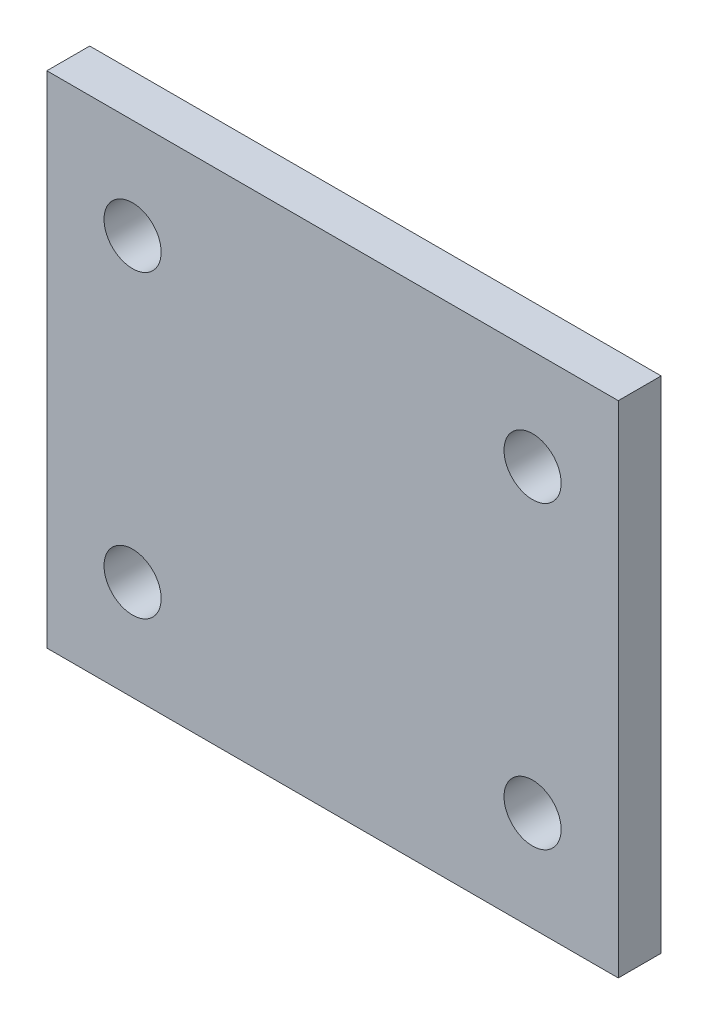
ISO-10303-21;
HEADER;
FILE_DESCRIPTION(('STEP AP214'),'2;1');
FILE_NAME('part.step','',(''),(''),'','','');
FILE_SCHEMA(('AUTOMOTIVE_DESIGN { 1 0 10303 214 1 1 1 1 }'));
ENDSEC;
DATA;
#1=APPLICATION_CONTEXT('core data for automotive mechanical design processes');
#2=APPLICATION_PROTOCOL_DEFINITION('international standard','automotive_design',2000,#1);
#3=PRODUCT_CONTEXT('',#1,'mechanical');
#4=PRODUCT('Part','Part','',(#3));
#5=PRODUCT_RELATED_PRODUCT_CATEGORY('part','',(#4));
#6=PRODUCT_DEFINITION_FORMATION('','',#4);
#7=PRODUCT_DEFINITION_CONTEXT('part definition',#1,'design');
#8=PRODUCT_DEFINITION('design','',#6,#7);
#9=PRODUCT_DEFINITION_SHAPE('','',#8);
#10=(LENGTH_UNIT() NAMED_UNIT(*) SI_UNIT(.MILLI.,.METRE.));
#11=(NAMED_UNIT(*) PLANE_ANGLE_UNIT() SI_UNIT($,.RADIAN.));
#12=(NAMED_UNIT(*) SI_UNIT($,.STERADIAN.) SOLID_ANGLE_UNIT());
#13=UNCERTAINTY_MEASURE_WITH_UNIT(LENGTH_MEASURE(1.E-05),#10,'distance_accuracy_value','');
#14=(GEOMETRIC_REPRESENTATION_CONTEXT(3) GLOBAL_UNCERTAINTY_ASSIGNED_CONTEXT((#13)) GLOBAL_UNIT_ASSIGNED_CONTEXT((#10,
#11,#12)) REPRESENTATION_CONTEXT('',''));
#15=CARTESIAN_POINT('',(0.,0.,0.));
#16=DIRECTION('',(0.,0.,1.));
#17=DIRECTION('',(1.,0.,0.));
#18=AXIS2_PLACEMENT_3D('',#15,#16,#17);
#19=CARTESIAN_POINT('',(-22.3897058823529,30.1960784313726,3.));
#20=DIRECTION('',(1.,0.,0.));
#21=DIRECTION('',(0.,0.,-1.));
#22=AXIS2_PLACEMENT_3D('',#19,#20,#21);
#23=PLANE('',#22);
#24=DIRECTION('',(0.,-1.,0.));
#25=VECTOR('',#24,1.);
#26=CARTESIAN_POINT('',(-22.3897058823529,30.1960784313726,0.));
#27=LINE('',#26,#25);
#28=CARTESIAN_POINT('',(-22.3897058823529,30.1960784313726,0.));
#29=VERTEX_POINT('',#28);
#30=CARTESIAN_POINT('',(-22.3897058823529,-4.80392156862745,0.));
#31=VERTEX_POINT('',#30);
#32=EDGE_CURVE('E95',#29,#31,#27,.T.);
#33=ORIENTED_EDGE('',*,*,#32,.T.);
#34=DIRECTION('',(0.,0.,-1.));
#35=VECTOR('',#34,1.);
#36=CARTESIAN_POINT('',(-22.3897058823529,-4.80392156862745,3.));
#37=LINE('',#36,#35);
#38=CARTESIAN_POINT('',(-22.3897058823529,-4.80392156862745,3.));
#39=VERTEX_POINT('',#38);
#40=EDGE_CURVE('E11',#39,#31,#37,.T.);
#41=ORIENTED_EDGE('',*,*,#40,.F.);
#42=DIRECTION('',(0.,-1.,0.));
#43=VECTOR('',#42,1.);
#44=CARTESIAN_POINT('',(-22.3897058823529,30.1960784313726,3.));
#45=LINE('',#44,#43);
#46=CARTESIAN_POINT('',(-22.3897058823529,30.1960784313726,3.));
#47=VERTEX_POINT('',#46);
#48=EDGE_CURVE('E83',#47,#39,#45,.T.);
#49=ORIENTED_EDGE('',*,*,#48,.F.);
#50=DIRECTION('',(0.,0.,-1.));
#51=VECTOR('',#50,1.);
#52=CARTESIAN_POINT('',(-22.3897058823529,30.1960784313726,3.));
#53=LINE('',#52,#51);
#54=EDGE_CURVE('E91',#47,#29,#53,.T.);
#55=ORIENTED_EDGE('',*,*,#54,.T.);
#56=EDGE_LOOP('',(#33,#41,#49,#55));
#57=FACE_BOUND('',#56,.T.);
#58=ADVANCED_FACE('F32',(#57),#23,.F.);
#59=CARTESIAN_POINT('',(17.6102941176471,-4.80392156862744,3.));
#60=DIRECTION('',(0.,1.,0.));
#61=DIRECTION('',(-1.,0.,0.));
#62=AXIS2_PLACEMENT_3D('',#59,#60,#61);
#63=PLANE('',#62);
#64=DIRECTION('',(1.,0.,0.));
#65=VECTOR('',#64,1.);
#66=CARTESIAN_POINT('',(17.6102941176471,-4.80392156862744,0.));
#67=LINE('',#66,#65);
#68=CARTESIAN_POINT('',(17.6102941176471,-4.80392156862744,0.));
#69=VERTEX_POINT('',#68);
#70=EDGE_CURVE('E87',#31,#69,#67,.T.);
#71=ORIENTED_EDGE('',*,*,#70,.T.);
#72=DIRECTION('',(0.,0.,-1.));
#73=VECTOR('',#72,1.);
#74=CARTESIAN_POINT('',(17.6102941176471,-4.80392156862744,3.));
#75=LINE('',#74,#73);
#76=CARTESIAN_POINT('',(17.6102941176471,-4.80392156862744,3.));
#77=VERTEX_POINT('',#76);
#78=EDGE_CURVE('E40',#77,#69,#75,.T.);
#79=ORIENTED_EDGE('',*,*,#78,.F.);
#80=DIRECTION('',(1.,0.,0.));
#81=VECTOR('',#80,1.);
#82=CARTESIAN_POINT('',(17.6102941176471,-4.80392156862744,3.));
#83=LINE('',#82,#81);
#84=EDGE_CURVE('E78',#39,#77,#83,.T.);
#85=ORIENTED_EDGE('',*,*,#84,.F.);
#86=ORIENTED_EDGE('',*,*,#40,.T.);
#87=EDGE_LOOP('',(#71,#79,#85,#86));
#88=FACE_BOUND('',#87,.T.);
#89=ADVANCED_FACE('F86',(#88),#63,.F.);
#90=CARTESIAN_POINT('',(17.6102941176471,30.1960784313726,3.));
#91=DIRECTION('',(-1.,0.,0.));
#92=DIRECTION('',(0.,-1.,0.));
#93=AXIS2_PLACEMENT_3D('',#90,#91,#92);
#94=PLANE('',#93);
#95=DIRECTION('',(0.,1.,0.));
#96=VECTOR('',#95,1.);
#97=CARTESIAN_POINT('',(17.6102941176471,30.1960784313726,0.));
#98=LINE('',#97,#96);
#99=CARTESIAN_POINT('',(17.6102941176471,30.1960784313726,0.));
#100=VERTEX_POINT('',#99);
#101=EDGE_CURVE('E65',#69,#100,#98,.T.);
#102=ORIENTED_EDGE('',*,*,#101,.T.);
#103=DIRECTION('',(0.,0.,-1.));
#104=VECTOR('',#103,1.);
#105=CARTESIAN_POINT('',(17.6102941176471,30.1960784313726,3.));
#106=LINE('',#105,#104);
#107=CARTESIAN_POINT('',(17.6102941176471,30.1960784313726,3.));
#108=VERTEX_POINT('',#107);
#109=EDGE_CURVE('E88',#108,#100,#106,.T.);
#110=ORIENTED_EDGE('',*,*,#109,.F.);
#111=DIRECTION('',(0.,1.,0.));
#112=VECTOR('',#111,1.);
#113=CARTESIAN_POINT('',(17.6102941176471,30.1960784313726,3.));
#114=LINE('',#113,#112);
#115=EDGE_CURVE('E81',#77,#108,#114,.T.);
#116=ORIENTED_EDGE('',*,*,#115,.F.);
#117=ORIENTED_EDGE('',*,*,#78,.T.);
#118=EDGE_LOOP('',(#102,#110,#116,#117));
#119=FACE_BOUND('',#118,.T.);
#120=ADVANCED_FACE('F89',(#119),#94,.F.);
#121=CARTESIAN_POINT('',(17.6102941176471,30.1960784313726,3.));
#122=DIRECTION('',(0.,-1.,0.));
#123=DIRECTION('',(1.,0.,0.));
#124=AXIS2_PLACEMENT_3D('',#121,#122,#123);
#125=PLANE('',#124);
#126=DIRECTION('',(-1.,0.,0.));
#127=VECTOR('',#126,1.);
#128=CARTESIAN_POINT('',(17.6102941176471,30.1960784313726,0.));
#129=LINE('',#128,#127);
#130=EDGE_CURVE('E71',#100,#29,#129,.T.);
#131=ORIENTED_EDGE('',*,*,#130,.T.);
#132=ORIENTED_EDGE('',*,*,#54,.F.);
#133=DIRECTION('',(-1.,0.,0.));
#134=VECTOR('',#133,1.);
#135=CARTESIAN_POINT('',(17.6102941176471,30.1960784313726,3.));
#136=LINE('',#135,#134);
#137=EDGE_CURVE('E48',#108,#47,#136,.T.);
#138=ORIENTED_EDGE('',*,*,#137,.F.);
#139=ORIENTED_EDGE('',*,*,#109,.T.);
#140=EDGE_LOOP('',(#131,#132,#138,#139));
#141=FACE_BOUND('',#140,.T.);
#142=ADVANCED_FACE('F103',(#141),#125,.F.);
#143=CARTESIAN_POINT('',(0.,0.,3.));
#144=DIRECTION('',(0.,0.,-1.));
#145=DIRECTION('',(-1.,0.,0.));
#146=AXIS2_PLACEMENT_3D('',#143,#144,#145);
#147=PLANE('',#146);
#148=CARTESIAN_POINT('',(-16.3897058823529,2.19607843137255,3.));
#149=DIRECTION('',(0.,0.,1.));
#150=DIRECTION('',(1.,0.,0.));
#151=AXIS2_PLACEMENT_3D('',#148,#149,#150);
#152=CIRCLE('',#151,2.);
#153=CARTESIAN_POINT('',(-14.3897058823529,2.19607843137255,3.));
#154=VERTEX_POINT('',#153);
#155=EDGE_CURVE('E127',#154,#154,#152,.T.);
#156=ORIENTED_EDGE('',*,*,#155,.F.);
#157=EDGE_LOOP('',(#156));
#158=FACE_BOUND('',#157,.T.);
#159=CARTESIAN_POINT('',(11.6102941176471,2.19607843137255,3.));
#160=DIRECTION('',(0.,0.,1.));
#161=DIRECTION('',(1.,0.,0.));
#162=AXIS2_PLACEMENT_3D('',#159,#160,#161);
#163=CIRCLE('',#162,2.);
#164=CARTESIAN_POINT('',(13.6102941176471,2.19607843137255,3.));
#165=VERTEX_POINT('',#164);
#166=EDGE_CURVE('E121',#165,#165,#163,.T.);
#167=ORIENTED_EDGE('',*,*,#166,.F.);
#168=EDGE_LOOP('',(#167));
#169=FACE_BOUND('',#168,.T.);
#170=CARTESIAN_POINT('',(11.6102941176471,23.1960784313726,3.));
#171=DIRECTION('',(0.,0.,1.));
#172=DIRECTION('',(1.,0.,0.));
#173=AXIS2_PLACEMENT_3D('',#170,#171,#172);
#174=CIRCLE('',#173,2.);
#175=CARTESIAN_POINT('',(13.6102941176471,23.1960784313726,3.));
#176=VERTEX_POINT('',#175);
#177=EDGE_CURVE('E115',#176,#176,#174,.T.);
#178=ORIENTED_EDGE('',*,*,#177,.F.);
#179=EDGE_LOOP('',(#178));
#180=FACE_BOUND('',#179,.T.);
#181=CARTESIAN_POINT('',(-16.3897058823529,23.1960784313726,3.));
#182=DIRECTION('',(0.,0.,1.));
#183=DIRECTION('',(1.,0.,0.));
#184=AXIS2_PLACEMENT_3D('',#181,#182,#183);
#185=CIRCLE('',#184,2.);
#186=CARTESIAN_POINT('',(-14.3897058823529,23.1960784313726,3.));
#187=VERTEX_POINT('',#186);
#188=EDGE_CURVE('E109',#187,#187,#185,.T.);
#189=ORIENTED_EDGE('',*,*,#188,.F.);
#190=EDGE_LOOP('',(#189));
#191=FACE_BOUND('',#190,.T.);
#192=ORIENTED_EDGE('',*,*,#48,.T.);
#193=ORIENTED_EDGE('',*,*,#84,.T.);
#194=ORIENTED_EDGE('',*,*,#115,.T.);
#195=ORIENTED_EDGE('',*,*,#137,.T.);
#196=EDGE_LOOP('',(#192,#193,#194,#195));
#197=FACE_BOUND('',#196,.T.);
#198=ADVANCED_FACE('F79',(#158,#169,#180,#191,#197),#147,.F.);
#199=CARTESIAN_POINT('',(0.,0.,0.));
#200=DIRECTION('',(0.,0.,-1.));
#201=DIRECTION('',(-1.,0.,0.));
#202=AXIS2_PLACEMENT_3D('',#199,#200,#201);
#203=PLANE('',#202);
#204=CARTESIAN_POINT('',(-16.3897058823529,2.19607843137255,0.));
#205=DIRECTION('',(0.,0.,1.));
#206=DIRECTION('',(1.,0.,0.));
#207=AXIS2_PLACEMENT_3D('',#204,#205,#206);
#208=CIRCLE('',#207,2.);
#209=CARTESIAN_POINT('',(-14.3897058823529,2.19607843137255,0.));
#210=VERTEX_POINT('',#209);
#211=EDGE_CURVE('E112',#210,#210,#208,.T.);
#212=ORIENTED_EDGE('',*,*,#211,.T.);
#213=EDGE_LOOP('',(#212));
#214=FACE_BOUND('',#213,.T.);
#215=CARTESIAN_POINT('',(11.6102941176471,2.19607843137255,0.));
#216=DIRECTION('',(0.,0.,1.));
#217=DIRECTION('',(1.,0.,0.));
#218=AXIS2_PLACEMENT_3D('',#215,#216,#217);
#219=CIRCLE('',#218,2.);
#220=CARTESIAN_POINT('',(13.6102941176471,2.19607843137255,0.));
#221=VERTEX_POINT('',#220);
#222=EDGE_CURVE('E124',#221,#221,#219,.T.);
#223=ORIENTED_EDGE('',*,*,#222,.T.);
#224=EDGE_LOOP('',(#223));
#225=FACE_BOUND('',#224,.T.);
#226=CARTESIAN_POINT('',(11.6102941176471,23.1960784313726,0.));
#227=DIRECTION('',(0.,0.,1.));
#228=DIRECTION('',(1.,0.,0.));
#229=AXIS2_PLACEMENT_3D('',#226,#227,#228);
#230=CIRCLE('',#229,2.);
#231=CARTESIAN_POINT('',(13.6102941176471,23.1960784313726,0.));
#232=VERTEX_POINT('',#231);
#233=EDGE_CURVE('E118',#232,#232,#230,.T.);
#234=ORIENTED_EDGE('',*,*,#233,.T.);
#235=EDGE_LOOP('',(#234));
#236=FACE_BOUND('',#235,.T.);
#237=CARTESIAN_POINT('',(-16.3897058823529,23.1960784313726,0.));
#238=DIRECTION('',(0.,0.,1.));
#239=DIRECTION('',(1.,0.,0.));
#240=AXIS2_PLACEMENT_3D('',#237,#238,#239);
#241=CIRCLE('',#240,2.);
#242=CARTESIAN_POINT('',(-14.3897058823529,23.1960784313726,0.));
#243=VERTEX_POINT('',#242);
#244=EDGE_CURVE('E98',#243,#243,#241,.T.);
#245=ORIENTED_EDGE('',*,*,#244,.T.);
#246=EDGE_LOOP('',(#245));
#247=FACE_BOUND('',#246,.T.);
#248=ORIENTED_EDGE('',*,*,#32,.F.);
#249=ORIENTED_EDGE('',*,*,#130,.F.);
#250=ORIENTED_EDGE('',*,*,#101,.F.);
#251=ORIENTED_EDGE('',*,*,#70,.F.);
#252=EDGE_LOOP('',(#248,#249,#250,#251));
#253=FACE_BOUND('',#252,.T.);
#254=ADVANCED_FACE('F106',(#214,#225,#236,#247,#253),#203,.T.);
#255=CARTESIAN_POINT('',(-16.3897058823529,23.1960784313726,0.));
#256=DIRECTION('',(0.,0.,1.));
#257=DIRECTION('',(1.,0.,0.));
#258=AXIS2_PLACEMENT_3D('',#255,#256,#257);
#259=CYLINDRICAL_SURFACE('',#258,2.);
#260=ORIENTED_EDGE('',*,*,#244,.F.);
#261=EDGE_LOOP('',(#260));
#262=FACE_BOUND('',#261,.T.);
#263=ORIENTED_EDGE('',*,*,#188,.T.);
#264=EDGE_LOOP('',(#263));
#265=FACE_BOUND('',#264,.T.);
#266=ADVANCED_FACE('F151',(#262,#265),#259,.F.);
#267=CARTESIAN_POINT('',(11.6102941176471,23.1960784313726,0.));
#268=DIRECTION('',(0.,0.,1.));
#269=DIRECTION('',(1.,0.,0.));
#270=AXIS2_PLACEMENT_3D('',#267,#268,#269);
#271=CYLINDRICAL_SURFACE('',#270,2.);
#272=ORIENTED_EDGE('',*,*,#233,.F.);
#273=EDGE_LOOP('',(#272));
#274=FACE_BOUND('',#273,.T.);
#275=ORIENTED_EDGE('',*,*,#177,.T.);
#276=EDGE_LOOP('',(#275));
#277=FACE_BOUND('',#276,.T.);
#278=ADVANCED_FACE('F153',(#274,#277),#271,.F.);
#279=CARTESIAN_POINT('',(11.6102941176471,2.19607843137255,0.));
#280=DIRECTION('',(0.,0.,1.));
#281=DIRECTION('',(1.,0.,0.));
#282=AXIS2_PLACEMENT_3D('',#279,#280,#281);
#283=CYLINDRICAL_SURFACE('',#282,2.);
#284=ORIENTED_EDGE('',*,*,#222,.F.);
#285=EDGE_LOOP('',(#284));
#286=FACE_BOUND('',#285,.T.);
#287=ORIENTED_EDGE('',*,*,#166,.T.);
#288=EDGE_LOOP('',(#287));
#289=FACE_BOUND('',#288,.T.);
#290=ADVANCED_FACE('F138',(#286,#289),#283,.F.);
#291=CARTESIAN_POINT('',(-16.3897058823529,2.19607843137255,0.));
#292=DIRECTION('',(0.,0.,1.));
#293=DIRECTION('',(1.,0.,0.));
#294=AXIS2_PLACEMENT_3D('',#291,#292,#293);
#295=CYLINDRICAL_SURFACE('',#294,2.);
#296=ORIENTED_EDGE('',*,*,#211,.F.);
#297=EDGE_LOOP('',(#296));
#298=FACE_BOUND('',#297,.T.);
#299=ORIENTED_EDGE('',*,*,#155,.T.);
#300=EDGE_LOOP('',(#299));
#301=FACE_BOUND('',#300,.T.);
#302=ADVANCED_FACE('F135',(#298,#301),#295,.F.);
#303=CLOSED_SHELL('',(#58,#89,#120,#142,#198,#254,#266,#278,#290,#302));
#304=MANIFOLD_SOLID_BREP('B2',#303);
#305=ADVANCED_BREP_SHAPE_REPRESENTATION('',(#18,#304),#14);
#306=SHAPE_DEFINITION_REPRESENTATION(#9,#305);
ENDSEC;
END-ISO-10303-21;
